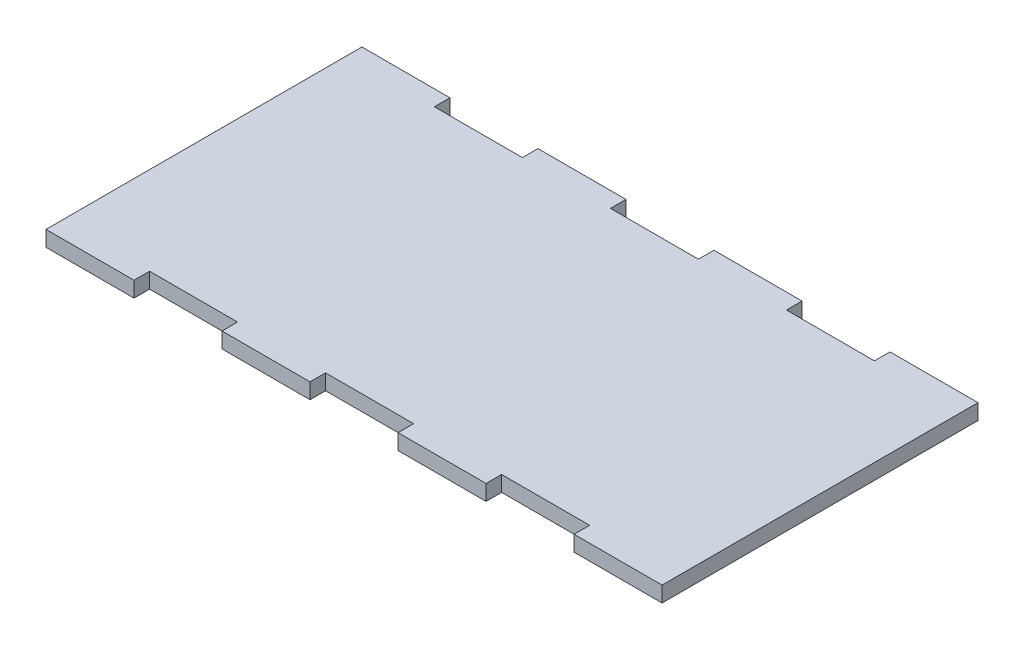
ISO-10303-21;
HEADER;
FILE_DESCRIPTION(('STEP AP214'),'2;1');
FILE_NAME('part.step','',(''),(''),'','','');
FILE_SCHEMA(('AUTOMOTIVE_DESIGN { 1 0 10303 214 1 1 1 1 }'));
ENDSEC;
DATA;
#1=APPLICATION_CONTEXT('core data for automotive mechanical design processes');
#2=APPLICATION_PROTOCOL_DEFINITION('international standard','automotive_design',2000,#1);
#3=PRODUCT_CONTEXT('',#1,'mechanical');
#4=PRODUCT('Part','Part','',(#3));
#5=PRODUCT_RELATED_PRODUCT_CATEGORY('part','',(#4));
#6=PRODUCT_DEFINITION_FORMATION('','',#4);
#7=PRODUCT_DEFINITION_CONTEXT('part definition',#1,'design');
#8=PRODUCT_DEFINITION('design','',#6,#7);
#9=PRODUCT_DEFINITION_SHAPE('','',#8);
#10=(LENGTH_UNIT() NAMED_UNIT(*) SI_UNIT(.MILLI.,.METRE.));
#11=(NAMED_UNIT(*) PLANE_ANGLE_UNIT() SI_UNIT($,.RADIAN.));
#12=(NAMED_UNIT(*) SI_UNIT($,.STERADIAN.) SOLID_ANGLE_UNIT());
#13=UNCERTAINTY_MEASURE_WITH_UNIT(LENGTH_MEASURE(1.E-05),#10,'distance_accuracy_value','');
#14=(GEOMETRIC_REPRESENTATION_CONTEXT(3) GLOBAL_UNCERTAINTY_ASSIGNED_CONTEXT((#13)) GLOBAL_UNIT_ASSIGNED_CONTEXT((#10,
#11,#12)) REPRESENTATION_CONTEXT('',''));
#15=CARTESIAN_POINT('',(0.,0.,0.));
#16=DIRECTION('',(0.,0.,1.));
#17=DIRECTION('',(1.,0.,0.));
#18=AXIS2_PLACEMENT_3D('',#15,#16,#17);
#19=CARTESIAN_POINT('',(49.53,2.5,25.4));
#20=DIRECTION('',(0.,0.,-1.));
#21=DIRECTION('',(-1.,0.,0.));
#22=AXIS2_PLACEMENT_3D('',#19,#20,#21);
#23=PLANE('',#22);
#24=DIRECTION('',(1.,0.,0.));
#25=VECTOR('',#24,1.);
#26=CARTESIAN_POINT('',(49.53,0.,25.4));
#27=LINE('',#26,#25);
#28=CARTESIAN_POINT('',(-49.53,0.,25.4));
#29=VERTEX_POINT('',#28);
#30=CARTESIAN_POINT('',(-35.3785714285714,0.,25.4));
#31=VERTEX_POINT('',#30);
#32=EDGE_CURVE('E285',#29,#31,#27,.T.);
#33=ORIENTED_EDGE('',*,*,#32,.T.);
#34=DIRECTION('',(0.,1.,0.));
#35=VECTOR('',#34,1.);
#36=CARTESIAN_POINT('',(-35.3785714285714,-0.0400000000000001,25.4));
#37=LINE('',#36,#35);
#38=CARTESIAN_POINT('',(-35.3785714285714,2.5,25.4));
#39=VERTEX_POINT('',#38);
#40=EDGE_CURVE('E413',#31,#39,#37,.T.);
#41=ORIENTED_EDGE('',*,*,#40,.T.);
#42=DIRECTION('',(1.,0.,0.));
#43=VECTOR('',#42,1.);
#44=CARTESIAN_POINT('',(49.53,2.5,25.4));
#45=LINE('',#44,#43);
#46=CARTESIAN_POINT('',(-49.53,2.5,25.4));
#47=VERTEX_POINT('',#46);
#48=EDGE_CURVE('E262',#47,#39,#45,.T.);
#49=ORIENTED_EDGE('',*,*,#48,.F.);
#50=DIRECTION('',(0.,-1.,0.));
#51=VECTOR('',#50,1.);
#52=CARTESIAN_POINT('',(-49.53,2.5,25.4));
#53=LINE('',#52,#51);
#54=EDGE_CURVE('E310',#47,#29,#53,.T.);
#55=ORIENTED_EDGE('',*,*,#54,.T.);
#56=EDGE_LOOP('',(#33,#41,#49,#55));
#57=FACE_BOUND('',#56,.T.);
#58=ADVANCED_FACE('F38',(#57),#23,.F.);
#59=CARTESIAN_POINT('',(-21.2271428571429,2.5,25.4));
#60=VERTEX_POINT('',#59);
#61=CARTESIAN_POINT('',(-7.07571428571428,2.5,25.4));
#62=VERTEX_POINT('',#61);
#63=EDGE_CURVE('E256',#60,#62,#45,.T.);
#64=ORIENTED_EDGE('',*,*,#63,.F.);
#65=DIRECTION('',(0.,1.,0.));
#66=VECTOR('',#65,1.);
#67=CARTESIAN_POINT('',(-21.2271428571429,-0.0400000000000001,25.4));
#68=LINE('',#67,#66);
#69=CARTESIAN_POINT('',(-21.2271428571429,0.,25.4));
#70=VERTEX_POINT('',#69);
#71=EDGE_CURVE('E479',#70,#60,#68,.T.);
#72=ORIENTED_EDGE('',*,*,#71,.F.);
#73=CARTESIAN_POINT('',(-7.07571428571428,0.,25.4));
#74=VERTEX_POINT('',#73);
#75=EDGE_CURVE('E290',#70,#74,#27,.T.);
#76=ORIENTED_EDGE('',*,*,#75,.T.);
#77=DIRECTION('',(0.,1.,0.));
#78=VECTOR('',#77,1.);
#79=CARTESIAN_POINT('',(-7.07571428571428,-0.0400000000000001,25.4));
#80=LINE('',#79,#78);
#81=EDGE_CURVE('E493',#74,#62,#80,.T.);
#82=ORIENTED_EDGE('',*,*,#81,.T.);
#83=EDGE_LOOP('',(#64,#72,#76,#82));
#84=FACE_BOUND('',#83,.T.);
#85=ADVANCED_FACE('F601',(#84),#23,.F.);
#86=CARTESIAN_POINT('',(7.07571428571428,2.5,25.4));
#87=VERTEX_POINT('',#86);
#88=CARTESIAN_POINT('',(21.2271428571429,2.5,25.4));
#89=VERTEX_POINT('',#88);
#90=EDGE_CURVE('E242',#87,#89,#45,.T.);
#91=ORIENTED_EDGE('',*,*,#90,.F.);
#92=DIRECTION('',(0.,1.,0.));
#93=VECTOR('',#92,1.);
#94=CARTESIAN_POINT('',(7.07571428571428,-0.0400000000000001,25.4));
#95=LINE('',#94,#93);
#96=CARTESIAN_POINT('',(7.07571428571428,0.,25.4));
#97=VERTEX_POINT('',#96);
#98=EDGE_CURVE('E499',#97,#87,#95,.T.);
#99=ORIENTED_EDGE('',*,*,#98,.F.);
#100=CARTESIAN_POINT('',(21.2271428571429,0.,25.4));
#101=VERTEX_POINT('',#100);
#102=EDGE_CURVE('E244',#97,#101,#27,.T.);
#103=ORIENTED_EDGE('',*,*,#102,.T.);
#104=DIRECTION('',(0.,1.,0.));
#105=VECTOR('',#104,1.);
#106=CARTESIAN_POINT('',(21.2271428571429,-0.0400000000000001,25.4));
#107=LINE('',#106,#105);
#108=EDGE_CURVE('E226',#101,#89,#107,.T.);
#109=ORIENTED_EDGE('',*,*,#108,.T.);
#110=EDGE_LOOP('',(#91,#99,#103,#109));
#111=FACE_BOUND('',#110,.T.);
#112=ADVANCED_FACE('F240',(#111),#23,.F.);
#113=CARTESIAN_POINT('',(49.53,2.5,-25.4));
#114=DIRECTION('',(0.,0.,1.));
#115=DIRECTION('',(1.,0.,0.));
#116=AXIS2_PLACEMENT_3D('',#113,#114,#115);
#117=PLANE('',#116);
#118=DIRECTION('',(-1.,0.,0.));
#119=VECTOR('',#118,1.);
#120=CARTESIAN_POINT('',(49.53,2.5,-25.4));
#121=LINE('',#120,#119);
#122=CARTESIAN_POINT('',(-7.07571428571428,2.5,-25.4));
#123=VERTEX_POINT('',#122);
#124=CARTESIAN_POINT('',(-21.2271428571429,2.5,-25.4));
#125=VERTEX_POINT('',#124);
#126=EDGE_CURVE('E421',#123,#125,#121,.T.);
#127=ORIENTED_EDGE('',*,*,#126,.F.);
#128=DIRECTION('',(0.,1.,0.));
#129=VECTOR('',#128,1.);
#130=CARTESIAN_POINT('',(-7.07571428571428,-0.0400000000000001,-25.4));
#131=LINE('',#130,#129);
#132=CARTESIAN_POINT('',(-7.07571428571428,0.,-25.4));
#133=VERTEX_POINT('',#132);
#134=EDGE_CURVE('E508',#133,#123,#131,.T.);
#135=ORIENTED_EDGE('',*,*,#134,.F.);
#136=DIRECTION('',(-1.,0.,0.));
#137=VECTOR('',#136,1.);
#138=CARTESIAN_POINT('',(49.53,0.,-25.4));
#139=LINE('',#138,#137);
#140=CARTESIAN_POINT('',(-21.2271428571429,0.,-25.4));
#141=VERTEX_POINT('',#140);
#142=EDGE_CURVE('E393',#133,#141,#139,.T.);
#143=ORIENTED_EDGE('',*,*,#142,.T.);
#144=DIRECTION('',(0.,1.,0.));
#145=VECTOR('',#144,1.);
#146=CARTESIAN_POINT('',(-21.2271428571429,-0.0400000000000001,-25.4));
#147=LINE('',#146,#145);
#148=EDGE_CURVE('E518',#141,#125,#147,.T.);
#149=ORIENTED_EDGE('',*,*,#148,.T.);
#150=EDGE_LOOP('',(#127,#135,#143,#149));
#151=FACE_BOUND('',#150,.T.);
#152=ADVANCED_FACE('F532',(#151),#117,.F.);
#153=CARTESIAN_POINT('',(21.2271428571429,0.,-25.4));
#154=VERTEX_POINT('',#153);
#155=CARTESIAN_POINT('',(7.07571428571428,0.,-25.4));
#156=VERTEX_POINT('',#155);
#157=EDGE_CURVE('E298',#154,#156,#139,.T.);
#158=ORIENTED_EDGE('',*,*,#157,.T.);
#159=DIRECTION('',(0.,1.,0.));
#160=VECTOR('',#159,1.);
#161=CARTESIAN_POINT('',(7.07571428571428,-0.0400000000000001,-25.4));
#162=LINE('',#161,#160);
#163=CARTESIAN_POINT('',(7.07571428571428,2.5,-25.4));
#164=VERTEX_POINT('',#163);
#165=EDGE_CURVE('E389',#156,#164,#162,.T.);
#166=ORIENTED_EDGE('',*,*,#165,.T.);
#167=CARTESIAN_POINT('',(21.2271428571429,2.5,-25.4));
#168=VERTEX_POINT('',#167);
#169=EDGE_CURVE('E278',#168,#164,#121,.T.);
#170=ORIENTED_EDGE('',*,*,#169,.F.);
#171=DIRECTION('',(0.,1.,0.));
#172=VECTOR('',#171,1.);
#173=CARTESIAN_POINT('',(21.2271428571429,-0.0400000000000001,-25.4));
#174=LINE('',#173,#172);
#175=EDGE_CURVE('E391',#154,#168,#174,.T.);
#176=ORIENTED_EDGE('',*,*,#175,.F.);
#177=EDGE_LOOP('',(#158,#166,#170,#176));
#178=FACE_BOUND('',#177,.T.);
#179=ADVANCED_FACE('F387',(#178),#117,.F.);
#180=CARTESIAN_POINT('',(-35.3785714285714,2.5,-25.4));
#181=VERTEX_POINT('',#180);
#182=CARTESIAN_POINT('',(-49.53,2.5,-25.4));
#183=VERTEX_POINT('',#182);
#184=EDGE_CURVE('E272',#181,#183,#121,.T.);
#185=ORIENTED_EDGE('',*,*,#184,.F.);
#186=DIRECTION('',(0.,1.,0.));
#187=VECTOR('',#186,1.);
#188=CARTESIAN_POINT('',(-35.3785714285714,-0.0400000000000001,-25.4));
#189=LINE('',#188,#187);
#190=CARTESIAN_POINT('',(-35.3785714285714,0.,-25.4));
#191=VERTEX_POINT('',#190);
#192=EDGE_CURVE('E284',#191,#181,#189,.T.);
#193=ORIENTED_EDGE('',*,*,#192,.F.);
#194=CARTESIAN_POINT('',(-49.53,0.,-25.4));
#195=VERTEX_POINT('',#194);
#196=EDGE_CURVE('E293',#191,#195,#139,.T.);
#197=ORIENTED_EDGE('',*,*,#196,.T.);
#198=DIRECTION('',(0.,-1.,0.));
#199=VECTOR('',#198,1.);
#200=CARTESIAN_POINT('',(-49.53,2.5,-25.4));
#201=LINE('',#200,#199);
#202=EDGE_CURVE('E277',#183,#195,#201,.T.);
#203=ORIENTED_EDGE('',*,*,#202,.F.);
#204=EDGE_LOOP('',(#185,#193,#197,#203));
#205=FACE_BOUND('',#204,.T.);
#206=ADVANCED_FACE('F405',(#205),#117,.F.);
#207=CARTESIAN_POINT('',(-49.53,2.5,25.4));
#208=DIRECTION('',(1.,0.,0.));
#209=DIRECTION('',(0.,0.,-1.));
#210=AXIS2_PLACEMENT_3D('',#207,#208,#209);
#211=PLANE('',#210);
#212=DIRECTION('',(0.,0.,1.));
#213=VECTOR('',#212,1.);
#214=CARTESIAN_POINT('',(-49.53,0.,25.4));
#215=LINE('',#214,#213);
#216=EDGE_CURVE('E279',#195,#29,#215,.T.);
#217=ORIENTED_EDGE('',*,*,#216,.T.);
#218=ORIENTED_EDGE('',*,*,#54,.F.);
#219=DIRECTION('',(0.,0.,1.));
#220=VECTOR('',#219,1.);
#221=CARTESIAN_POINT('',(-49.53,2.5,25.4));
#222=LINE('',#221,#220);
#223=EDGE_CURVE('E263',#183,#47,#222,.T.);
#224=ORIENTED_EDGE('',*,*,#223,.F.);
#225=ORIENTED_EDGE('',*,*,#202,.T.);
#226=EDGE_LOOP('',(#217,#218,#224,#225));
#227=FACE_BOUND('',#226,.T.);
#228=ADVANCED_FACE('F40',(#227),#211,.F.);
#229=CARTESIAN_POINT('',(35.3785714285714,2.5,25.4));
#230=VERTEX_POINT('',#229);
#231=CARTESIAN_POINT('',(49.53,2.5,25.4));
#232=VERTEX_POINT('',#231);
#233=EDGE_CURVE('E257',#230,#232,#45,.T.);
#234=ORIENTED_EDGE('',*,*,#233,.F.);
#235=DIRECTION('',(0.,1.,0.));
#236=VECTOR('',#235,1.);
#237=CARTESIAN_POINT('',(35.3785714285714,-0.0400000000000001,25.4));
#238=LINE('',#237,#236);
#239=CARTESIAN_POINT('',(35.3785714285714,0.,25.4));
#240=VERTEX_POINT('',#239);
#241=EDGE_CURVE('E246',#240,#230,#238,.T.);
#242=ORIENTED_EDGE('',*,*,#241,.F.);
#243=CARTESIAN_POINT('',(49.53,0.,25.4));
#244=VERTEX_POINT('',#243);
#245=EDGE_CURVE('E283',#240,#244,#27,.T.);
#246=ORIENTED_EDGE('',*,*,#245,.T.);
#247=DIRECTION('',(0.,-1.,0.));
#248=VECTOR('',#247,1.);
#249=CARTESIAN_POINT('',(49.53,2.5,25.4));
#250=LINE('',#249,#248);
#251=EDGE_CURVE('E306',#232,#244,#250,.T.);
#252=ORIENTED_EDGE('',*,*,#251,.F.);
#253=EDGE_LOOP('',(#234,#242,#246,#252));
#254=FACE_BOUND('',#253,.T.);
#255=ADVANCED_FACE('F573',(#254),#23,.F.);
#256=CARTESIAN_POINT('',(49.53,2.5,25.4));
#257=DIRECTION('',(-1.,0.,0.));
#258=DIRECTION('',(0.,0.,1.));
#259=AXIS2_PLACEMENT_3D('',#256,#257,#258);
#260=PLANE('',#259);
#261=DIRECTION('',(0.,0.,-1.));
#262=VECTOR('',#261,1.);
#263=CARTESIAN_POINT('',(49.53,0.,25.4));
#264=LINE('',#263,#262);
#265=CARTESIAN_POINT('',(49.53,0.,-25.4));
#266=VERTEX_POINT('',#265);
#267=EDGE_CURVE('E289',#244,#266,#264,.T.);
#268=ORIENTED_EDGE('',*,*,#267,.T.);
#269=DIRECTION('',(0.,-1.,0.));
#270=VECTOR('',#269,1.);
#271=CARTESIAN_POINT('',(49.53,2.5,-25.4));
#272=LINE('',#271,#270);
#273=CARTESIAN_POINT('',(49.53,2.5,-25.4));
#274=VERTEX_POINT('',#273);
#275=EDGE_CURVE('E302',#274,#266,#272,.T.);
#276=ORIENTED_EDGE('',*,*,#275,.F.);
#277=DIRECTION('',(0.,0.,-1.));
#278=VECTOR('',#277,1.);
#279=CARTESIAN_POINT('',(49.53,2.5,25.4));
#280=LINE('',#279,#278);
#281=EDGE_CURVE('E268',#232,#274,#280,.T.);
#282=ORIENTED_EDGE('',*,*,#281,.F.);
#283=ORIENTED_EDGE('',*,*,#251,.T.);
#284=EDGE_LOOP('',(#268,#276,#282,#283));
#285=FACE_BOUND('',#284,.T.);
#286=ADVANCED_FACE('F579',(#285),#260,.F.);
#287=CARTESIAN_POINT('',(35.3785714285714,0.,-25.4));
#288=VERTEX_POINT('',#287);
#289=EDGE_CURVE('E294',#266,#288,#139,.T.);
#290=ORIENTED_EDGE('',*,*,#289,.T.);
#291=DIRECTION('',(0.,1.,0.));
#292=VECTOR('',#291,1.);
#293=CARTESIAN_POINT('',(35.3785714285714,-0.0400000000000001,-25.4));
#294=LINE('',#293,#292);
#295=CARTESIAN_POINT('',(35.3785714285714,2.5,-25.4));
#296=VERTEX_POINT('',#295);
#297=EDGE_CURVE('E457',#288,#296,#294,.T.);
#298=ORIENTED_EDGE('',*,*,#297,.T.);
#299=EDGE_CURVE('E273',#274,#296,#121,.T.);
#300=ORIENTED_EDGE('',*,*,#299,.F.);
#301=ORIENTED_EDGE('',*,*,#275,.T.);
#302=EDGE_LOOP('',(#290,#298,#300,#301));
#303=FACE_BOUND('',#302,.T.);
#304=ADVANCED_FACE('F582',(#303),#117,.F.);
#305=CARTESIAN_POINT('',(0.,2.5,0.));
#306=DIRECTION('',(0.,1.,0.));
#307=DIRECTION('',(0.,0.,1.));
#308=AXIS2_PLACEMENT_3D('',#305,#306,#307);
#309=PLANE('',#308);
#310=DIRECTION('',(0.,0.,1.));
#311=VECTOR('',#310,1.);
#312=CARTESIAN_POINT('',(-7.07571428571428,2.5,-25.4));
#313=LINE('',#312,#311);
#314=CARTESIAN_POINT('',(-7.07571428571428,2.5,-22.9));
#315=VERTEX_POINT('',#314);
#316=EDGE_CURVE('E456',#123,#315,#313,.T.);
#317=ORIENTED_EDGE('',*,*,#316,.F.);
#318=ORIENTED_EDGE('',*,*,#126,.T.);
#319=DIRECTION('',(0.,0.,-1.));
#320=VECTOR('',#319,1.);
#321=CARTESIAN_POINT('',(-21.2271428571429,2.5,-25.4));
#322=LINE('',#321,#320);
#323=CARTESIAN_POINT('',(-21.2271428571429,2.5,-22.9));
#324=VERTEX_POINT('',#323);
#325=EDGE_CURVE('E512',#324,#125,#322,.T.);
#326=ORIENTED_EDGE('',*,*,#325,.F.);
#327=DIRECTION('',(1.,0.,0.));
#328=VECTOR('',#327,1.);
#329=CARTESIAN_POINT('',(-35.3785714285714,2.5,-22.9));
#330=LINE('',#329,#328);
#331=CARTESIAN_POINT('',(-35.3785714285714,2.5,-22.9));
#332=VERTEX_POINT('',#331);
#333=EDGE_CURVE('E507',#332,#324,#330,.T.);
#334=ORIENTED_EDGE('',*,*,#333,.F.);
#335=DIRECTION('',(0.,0.,1.));
#336=VECTOR('',#335,1.);
#337=CARTESIAN_POINT('',(-35.3785714285714,2.5,-25.4));
#338=LINE('',#337,#336);
#339=EDGE_CURVE('E419',#181,#332,#338,.T.);
#340=ORIENTED_EDGE('',*,*,#339,.F.);
#341=ORIENTED_EDGE('',*,*,#184,.T.);
#342=ORIENTED_EDGE('',*,*,#223,.T.);
#343=ORIENTED_EDGE('',*,*,#48,.T.);
#344=DIRECTION('',(0.,0.,1.));
#345=VECTOR('',#344,1.);
#346=CARTESIAN_POINT('',(-35.3785714285714,2.5,22.9));
#347=LINE('',#346,#345);
#348=CARTESIAN_POINT('',(-35.3785714285714,2.5,22.9));
#349=VERTEX_POINT('',#348);
#350=EDGE_CURVE('E465',#349,#39,#347,.T.);
#351=ORIENTED_EDGE('',*,*,#350,.F.);
#352=DIRECTION('',(-1.,0.,0.));
#353=VECTOR('',#352,1.);
#354=CARTESIAN_POINT('',(-35.3785714285714,2.5,22.9));
#355=LINE('',#354,#353);
#356=CARTESIAN_POINT('',(-21.2271428571429,2.5,22.9));
#357=VERTEX_POINT('',#356);
#358=EDGE_CURVE('E473',#357,#349,#355,.T.);
#359=ORIENTED_EDGE('',*,*,#358,.F.);
#360=DIRECTION('',(0.,0.,-1.));
#361=VECTOR('',#360,1.);
#362=CARTESIAN_POINT('',(-21.2271428571429,2.5,22.9));
#363=LINE('',#362,#361);
#364=EDGE_CURVE('E468',#60,#357,#363,.T.);
#365=ORIENTED_EDGE('',*,*,#364,.F.);
#366=ORIENTED_EDGE('',*,*,#63,.T.);
#367=DIRECTION('',(0.,0.,1.));
#368=VECTOR('',#367,1.);
#369=CARTESIAN_POINT('',(-7.07571428571428,2.5,22.9));
#370=LINE('',#369,#368);
#371=CARTESIAN_POINT('',(-7.07571428571428,2.5,22.9));
#372=VERTEX_POINT('',#371);
#373=EDGE_CURVE('E484',#372,#62,#370,.T.);
#374=ORIENTED_EDGE('',*,*,#373,.F.);
#375=DIRECTION('',(-1.,0.,0.));
#376=VECTOR('',#375,1.);
#377=CARTESIAN_POINT('',(-7.07571428571428,2.5,22.9));
#378=LINE('',#377,#376);
#379=CARTESIAN_POINT('',(7.07571428571428,2.5,22.9));
#380=VERTEX_POINT('',#379);
#381=EDGE_CURVE('E489',#380,#372,#378,.T.);
#382=ORIENTED_EDGE('',*,*,#381,.F.);
#383=DIRECTION('',(0.,0.,-1.));
#384=VECTOR('',#383,1.);
#385=CARTESIAN_POINT('',(7.07571428571428,2.5,22.9));
#386=LINE('',#385,#384);
#387=EDGE_CURVE('E254',#87,#380,#386,.T.);
#388=ORIENTED_EDGE('',*,*,#387,.F.);
#389=ORIENTED_EDGE('',*,*,#90,.T.);
#390=DIRECTION('',(0.,0.,1.));
#391=VECTOR('',#390,1.);
#392=CARTESIAN_POINT('',(21.2271428571429,2.5,22.9));
#393=LINE('',#392,#391);
#394=CARTESIAN_POINT('',(21.2271428571429,2.5,22.9));
#395=VERTEX_POINT('',#394);
#396=EDGE_CURVE('E223',#395,#89,#393,.T.);
#397=ORIENTED_EDGE('',*,*,#396,.F.);
#398=DIRECTION('',(-1.,0.,0.));
#399=VECTOR('',#398,1.);
#400=CARTESIAN_POINT('',(21.2271428571429,2.5,22.9));
#401=LINE('',#400,#399);
#402=CARTESIAN_POINT('',(35.3785714285714,2.5,22.9));
#403=VERTEX_POINT('',#402);
#404=EDGE_CURVE('E247',#403,#395,#401,.T.);
#405=ORIENTED_EDGE('',*,*,#404,.F.);
#406=DIRECTION('',(0.,0.,-1.));
#407=VECTOR('',#406,1.);
#408=CARTESIAN_POINT('',(35.3785714285714,2.5,22.9));
#409=LINE('',#408,#407);
#410=EDGE_CURVE('E235',#230,#403,#409,.T.);
#411=ORIENTED_EDGE('',*,*,#410,.F.);
#412=ORIENTED_EDGE('',*,*,#233,.T.);
#413=ORIENTED_EDGE('',*,*,#281,.T.);
#414=ORIENTED_EDGE('',*,*,#299,.T.);
#415=DIRECTION('',(0.,0.,-1.));
#416=VECTOR('',#415,1.);
#417=CARTESIAN_POINT('',(35.3785714285714,2.5,-25.4));
#418=LINE('',#417,#416);
#419=CARTESIAN_POINT('',(35.3785714285714,2.5,-22.9));
#420=VERTEX_POINT('',#419);
#421=EDGE_CURVE('E443',#420,#296,#418,.T.);
#422=ORIENTED_EDGE('',*,*,#421,.F.);
#423=DIRECTION('',(1.,0.,0.));
#424=VECTOR('',#423,1.);
#425=CARTESIAN_POINT('',(21.2271428571429,2.5,-22.9));
#426=LINE('',#425,#424);
#427=CARTESIAN_POINT('',(21.2271428571429,2.5,-22.9));
#428=VERTEX_POINT('',#427);
#429=EDGE_CURVE('E435',#428,#420,#426,.T.);
#430=ORIENTED_EDGE('',*,*,#429,.F.);
#431=DIRECTION('',(0.,0.,1.));
#432=VECTOR('',#431,1.);
#433=CARTESIAN_POINT('',(21.2271428571429,2.5,-25.4));
#434=LINE('',#433,#432);
#435=EDGE_CURVE('E433',#168,#428,#434,.T.);
#436=ORIENTED_EDGE('',*,*,#435,.F.);
#437=ORIENTED_EDGE('',*,*,#169,.T.);
#438=DIRECTION('',(0.,0.,-1.));
#439=VECTOR('',#438,1.);
#440=CARTESIAN_POINT('',(7.07571428571428,2.5,-25.4));
#441=LINE('',#440,#439);
#442=CARTESIAN_POINT('',(7.07571428571428,2.5,-22.9));
#443=VERTEX_POINT('',#442);
#444=EDGE_CURVE('E430',#443,#164,#441,.T.);
#445=ORIENTED_EDGE('',*,*,#444,.F.);
#446=DIRECTION('',(1.,0.,0.));
#447=VECTOR('',#446,1.);
#448=CARTESIAN_POINT('',(-7.07571428571428,2.5,-22.9));
#449=LINE('',#448,#447);
#450=EDGE_CURVE('E542',#315,#443,#449,.T.);
#451=ORIENTED_EDGE('',*,*,#450,.F.);
#452=EDGE_LOOP('',(#317,#318,#326,#334,#340,#341,#342,#343,#351,#359,#365,#366,#374,#382,#388,
#389,#397,#405,#411,#412,#413,#414,#422,#430,#436,#437,#445,#451));
#453=FACE_BOUND('',#452,.T.);
#454=ADVANCED_FACE('F251',(#453),#309,.T.);
#455=CARTESIAN_POINT('',(0.,0.,0.));
#456=DIRECTION('',(0.,1.,0.));
#457=DIRECTION('',(0.,0.,1.));
#458=AXIS2_PLACEMENT_3D('',#455,#456,#457);
#459=PLANE('',#458);
#460=ORIENTED_EDGE('',*,*,#142,.F.);
#461=DIRECTION('',(0.,0.,1.));
#462=VECTOR('',#461,1.);
#463=CARTESIAN_POINT('',(-7.07571428571428,0.,0.));
#464=LINE('',#463,#462);
#465=CARTESIAN_POINT('',(-7.07571428571428,0.,-22.9));
#466=VERTEX_POINT('',#465);
#467=EDGE_CURVE('E11',#133,#466,#464,.T.);
#468=ORIENTED_EDGE('',*,*,#467,.T.);
#469=DIRECTION('',(1.,0.,0.));
#470=VECTOR('',#469,1.);
#471=CARTESIAN_POINT('',(0.,0.,-22.9));
#472=LINE('',#471,#470);
#473=CARTESIAN_POINT('',(7.07571428571428,0.,-22.9));
#474=VERTEX_POINT('',#473);
#475=EDGE_CURVE('E373',#466,#474,#472,.T.);
#476=ORIENTED_EDGE('',*,*,#475,.T.);
#477=DIRECTION('',(0.,0.,-1.));
#478=VECTOR('',#477,1.);
#479=CARTESIAN_POINT('',(7.07571428571428,0.,0.));
#480=LINE('',#479,#478);
#481=EDGE_CURVE('E47',#474,#156,#480,.T.);
#482=ORIENTED_EDGE('',*,*,#481,.T.);
#483=ORIENTED_EDGE('',*,*,#157,.F.);
#484=DIRECTION('',(0.,0.,1.));
#485=VECTOR('',#484,1.);
#486=CARTESIAN_POINT('',(21.2271428571429,0.,0.));
#487=LINE('',#486,#485);
#488=CARTESIAN_POINT('',(21.2271428571429,0.,-22.9));
#489=VERTEX_POINT('',#488);
#490=EDGE_CURVE('E369',#154,#489,#487,.T.);
#491=ORIENTED_EDGE('',*,*,#490,.T.);
#492=DIRECTION('',(1.,0.,0.));
#493=VECTOR('',#492,1.);
#494=CARTESIAN_POINT('',(0.,0.,-22.9));
#495=LINE('',#494,#493);
#496=CARTESIAN_POINT('',(35.3785714285714,0.,-22.9));
#497=VERTEX_POINT('',#496);
#498=EDGE_CURVE('E361',#489,#497,#495,.T.);
#499=ORIENTED_EDGE('',*,*,#498,.T.);
#500=DIRECTION('',(0.,0.,-1.));
#501=VECTOR('',#500,1.);
#502=CARTESIAN_POINT('',(35.3785714285714,0.,0.));
#503=LINE('',#502,#501);
#504=EDGE_CURVE('E365',#497,#288,#503,.T.);
#505=ORIENTED_EDGE('',*,*,#504,.T.);
#506=ORIENTED_EDGE('',*,*,#289,.F.);
#507=ORIENTED_EDGE('',*,*,#267,.F.);
#508=ORIENTED_EDGE('',*,*,#245,.F.);
#509=DIRECTION('',(0.,0.,-1.));
#510=VECTOR('',#509,1.);
#511=CARTESIAN_POINT('',(35.3785714285714,0.,0.));
#512=LINE('',#511,#510);
#513=CARTESIAN_POINT('',(35.3785714285714,0.,22.9));
#514=VERTEX_POINT('',#513);
#515=EDGE_CURVE('E326',#240,#514,#512,.T.);
#516=ORIENTED_EDGE('',*,*,#515,.T.);
#517=DIRECTION('',(-1.,0.,0.));
#518=VECTOR('',#517,1.);
#519=CARTESIAN_POINT('',(0.,0.,22.9));
#520=LINE('',#519,#518);
#521=CARTESIAN_POINT('',(21.2271428571429,0.,22.9));
#522=VERTEX_POINT('',#521);
#523=EDGE_CURVE('E330',#514,#522,#520,.T.);
#524=ORIENTED_EDGE('',*,*,#523,.T.);
#525=DIRECTION('',(0.,0.,1.));
#526=VECTOR('',#525,1.);
#527=CARTESIAN_POINT('',(21.2271428571429,0.,0.));
#528=LINE('',#527,#526);
#529=EDGE_CURVE('E334',#522,#101,#528,.T.);
#530=ORIENTED_EDGE('',*,*,#529,.T.);
#531=ORIENTED_EDGE('',*,*,#102,.F.);
#532=DIRECTION('',(0.,0.,-1.));
#533=VECTOR('',#532,1.);
#534=CARTESIAN_POINT('',(7.07571428571428,0.,0.));
#535=LINE('',#534,#533);
#536=CARTESIAN_POINT('',(7.07571428571428,0.,22.9));
#537=VERTEX_POINT('',#536);
#538=EDGE_CURVE('E337',#97,#537,#535,.T.);
#539=ORIENTED_EDGE('',*,*,#538,.T.);
#540=DIRECTION('',(-1.,0.,0.));
#541=VECTOR('',#540,1.);
#542=CARTESIAN_POINT('',(0.,0.,22.9));
#543=LINE('',#542,#541);
#544=CARTESIAN_POINT('',(-7.07571428571428,0.,22.9));
#545=VERTEX_POINT('',#544);
#546=EDGE_CURVE('E341',#537,#545,#543,.T.);
#547=ORIENTED_EDGE('',*,*,#546,.T.);
#548=DIRECTION('',(0.,0.,1.));
#549=VECTOR('',#548,1.);
#550=CARTESIAN_POINT('',(-7.07571428571428,0.,0.));
#551=LINE('',#550,#549);
#552=EDGE_CURVE('E345',#545,#74,#551,.T.);
#553=ORIENTED_EDGE('',*,*,#552,.T.);
#554=ORIENTED_EDGE('',*,*,#75,.F.);
#555=DIRECTION('',(0.,0.,-1.));
#556=VECTOR('',#555,1.);
#557=CARTESIAN_POINT('',(-21.2271428571429,0.,0.));
#558=LINE('',#557,#556);
#559=CARTESIAN_POINT('',(-21.2271428571429,0.,22.9));
#560=VERTEX_POINT('',#559);
#561=EDGE_CURVE('E349',#70,#560,#558,.T.);
#562=ORIENTED_EDGE('',*,*,#561,.T.);
#563=DIRECTION('',(-1.,0.,0.));
#564=VECTOR('',#563,1.);
#565=CARTESIAN_POINT('',(0.,0.,22.9));
#566=LINE('',#565,#564);
#567=CARTESIAN_POINT('',(-35.3785714285714,0.,22.9));
#568=VERTEX_POINT('',#567);
#569=EDGE_CURVE('E353',#560,#568,#566,.T.);
#570=ORIENTED_EDGE('',*,*,#569,.T.);
#571=DIRECTION('',(0.,0.,1.));
#572=VECTOR('',#571,1.);
#573=CARTESIAN_POINT('',(-35.3785714285714,0.,0.));
#574=LINE('',#573,#572);
#575=EDGE_CURVE('E357',#568,#31,#574,.T.);
#576=ORIENTED_EDGE('',*,*,#575,.T.);
#577=ORIENTED_EDGE('',*,*,#32,.F.);
#578=ORIENTED_EDGE('',*,*,#216,.F.);
#579=ORIENTED_EDGE('',*,*,#196,.F.);
#580=DIRECTION('',(0.,0.,1.));
#581=VECTOR('',#580,1.);
#582=CARTESIAN_POINT('',(-35.3785714285714,0.,0.));
#583=LINE('',#582,#581);
#584=CARTESIAN_POINT('',(-35.3785714285714,0.,-22.9));
#585=VERTEX_POINT('',#584);
#586=EDGE_CURVE('E322',#191,#585,#583,.T.);
#587=ORIENTED_EDGE('',*,*,#586,.T.);
#588=DIRECTION('',(1.,0.,0.));
#589=VECTOR('',#588,1.);
#590=CARTESIAN_POINT('',(0.,0.,-22.9));
#591=LINE('',#590,#589);
#592=CARTESIAN_POINT('',(-21.2271428571429,0.,-22.9));
#593=VERTEX_POINT('',#592);
#594=EDGE_CURVE('E314',#585,#593,#591,.T.);
#595=ORIENTED_EDGE('',*,*,#594,.T.);
#596=DIRECTION('',(0.,0.,-1.));
#597=VECTOR('',#596,1.);
#598=CARTESIAN_POINT('',(-21.2271428571429,0.,0.));
#599=LINE('',#598,#597);
#600=EDGE_CURVE('E318',#593,#141,#599,.T.);
#601=ORIENTED_EDGE('',*,*,#600,.T.);
#602=EDGE_LOOP('',(#460,#468,#476,#482,#483,#491,#499,#505,#506,#507,#508,#516,#524,#530,#531,
#539,#547,#553,#554,#562,#570,#576,#577,#578,#579,#587,#595,#601));
#603=FACE_BOUND('',#602,.T.);
#604=ADVANCED_FACE('F382',(#603),#459,.F.);
#605=CARTESIAN_POINT('',(-35.3785714285714,-0.0400000000000001,-25.4));
#606=DIRECTION('',(-1.,0.,0.));
#607=DIRECTION('',(0.,0.,1.));
#608=AXIS2_PLACEMENT_3D('',#605,#606,#607);
#609=PLANE('',#608);
#610=ORIENTED_EDGE('',*,*,#192,.T.);
#611=ORIENTED_EDGE('',*,*,#339,.T.);
#612=DIRECTION('',(0.,1.,0.));
#613=VECTOR('',#612,1.);
#614=CARTESIAN_POINT('',(-35.3785714285714,-0.0400000000000001,-22.9));
#615=LINE('',#614,#613);
#616=EDGE_CURVE('E515',#585,#332,#615,.T.);
#617=ORIENTED_EDGE('',*,*,#616,.F.);
#618=ORIENTED_EDGE('',*,*,#586,.F.);
#619=EDGE_LOOP('',(#610,#611,#617,#618));
#620=FACE_BOUND('',#619,.T.);
#621=ADVANCED_FACE('F528',(#620),#609,.F.);
#622=CARTESIAN_POINT('',(-21.2271428571429,-0.0400000000000001,-25.4));
#623=DIRECTION('',(1.,0.,0.));
#624=DIRECTION('',(0.,0.,-1.));
#625=AXIS2_PLACEMENT_3D('',#622,#623,#624);
#626=PLANE('',#625);
#627=DIRECTION('',(0.,1.,0.));
#628=VECTOR('',#627,1.);
#629=CARTESIAN_POINT('',(-21.2271428571429,-0.0400000000000001,-22.9));
#630=LINE('',#629,#628);
#631=EDGE_CURVE('E521',#593,#324,#630,.T.);
#632=ORIENTED_EDGE('',*,*,#631,.T.);
#633=ORIENTED_EDGE('',*,*,#325,.T.);
#634=ORIENTED_EDGE('',*,*,#148,.F.);
#635=ORIENTED_EDGE('',*,*,#600,.F.);
#636=EDGE_LOOP('',(#632,#633,#634,#635));
#637=FACE_BOUND('',#636,.T.);
#638=ADVANCED_FACE('F530',(#637),#626,.F.);
#639=CARTESIAN_POINT('',(-35.3785714285714,-0.0400000000000001,-22.9));
#640=DIRECTION('',(0.,0.,1.));
#641=DIRECTION('',(1.,0.,0.));
#642=AXIS2_PLACEMENT_3D('',#639,#640,#641);
#643=PLANE('',#642);
#644=ORIENTED_EDGE('',*,*,#616,.T.);
#645=ORIENTED_EDGE('',*,*,#333,.T.);
#646=ORIENTED_EDGE('',*,*,#631,.F.);
#647=ORIENTED_EDGE('',*,*,#594,.F.);
#648=EDGE_LOOP('',(#644,#645,#646,#647));
#649=FACE_BOUND('',#648,.T.);
#650=ADVANCED_FACE('F526',(#649),#643,.F.);
#651=CARTESIAN_POINT('',(21.2271428571429,-0.0400000000000001,22.9));
#652=DIRECTION('',(-1.,0.,0.));
#653=DIRECTION('',(0.,0.,1.));
#654=AXIS2_PLACEMENT_3D('',#651,#652,#653);
#655=PLANE('',#654);
#656=DIRECTION('',(0.,1.,0.));
#657=VECTOR('',#656,1.);
#658=CARTESIAN_POINT('',(21.2271428571429,-0.0400000000000001,22.9));
#659=LINE('',#658,#657);
#660=EDGE_CURVE('E229',#522,#395,#659,.T.);
#661=ORIENTED_EDGE('',*,*,#660,.T.);
#662=ORIENTED_EDGE('',*,*,#396,.T.);
#663=ORIENTED_EDGE('',*,*,#108,.F.);
#664=ORIENTED_EDGE('',*,*,#529,.F.);
#665=EDGE_LOOP('',(#661,#662,#663,#664));
#666=FACE_BOUND('',#665,.T.);
#667=ADVANCED_FACE('F225',(#666),#655,.F.);
#668=CARTESIAN_POINT('',(21.2271428571429,-0.0400000000000001,22.9));
#669=DIRECTION('',(0.,0.,-1.));
#670=DIRECTION('',(-1.,0.,0.));
#671=AXIS2_PLACEMENT_3D('',#668,#669,#670);
#672=PLANE('',#671);
#673=DIRECTION('',(0.,1.,0.));
#674=VECTOR('',#673,1.);
#675=CARTESIAN_POINT('',(35.3785714285714,-0.0400000000000001,22.9));
#676=LINE('',#675,#674);
#677=EDGE_CURVE('E553',#514,#403,#676,.T.);
#678=ORIENTED_EDGE('',*,*,#677,.T.);
#679=ORIENTED_EDGE('',*,*,#404,.T.);
#680=ORIENTED_EDGE('',*,*,#660,.F.);
#681=ORIENTED_EDGE('',*,*,#523,.F.);
#682=EDGE_LOOP('',(#678,#679,#680,#681));
#683=FACE_BOUND('',#682,.T.);
#684=ADVANCED_FACE('F569',(#683),#672,.F.);
#685=CARTESIAN_POINT('',(35.3785714285714,-0.0400000000000001,22.9));
#686=DIRECTION('',(1.,0.,0.));
#687=DIRECTION('',(0.,0.,-1.));
#688=AXIS2_PLACEMENT_3D('',#685,#686,#687);
#689=PLANE('',#688);
#690=ORIENTED_EDGE('',*,*,#241,.T.);
#691=ORIENTED_EDGE('',*,*,#410,.T.);
#692=ORIENTED_EDGE('',*,*,#677,.F.);
#693=ORIENTED_EDGE('',*,*,#515,.F.);
#694=EDGE_LOOP('',(#690,#691,#692,#693));
#695=FACE_BOUND('',#694,.T.);
#696=ADVANCED_FACE('F564',(#695),#689,.F.);
#697=CARTESIAN_POINT('',(-7.07571428571428,-0.0400000000000001,22.9));
#698=DIRECTION('',(-1.,0.,0.));
#699=DIRECTION('',(0.,0.,1.));
#700=AXIS2_PLACEMENT_3D('',#697,#698,#699);
#701=PLANE('',#700);
#702=DIRECTION('',(0.,1.,0.));
#703=VECTOR('',#702,1.);
#704=CARTESIAN_POINT('',(-7.07571428571428,-0.0400000000000001,22.9));
#705=LINE('',#704,#703);
#706=EDGE_CURVE('E469',#545,#372,#705,.T.);
#707=ORIENTED_EDGE('',*,*,#706,.T.);
#708=ORIENTED_EDGE('',*,*,#373,.T.);
#709=ORIENTED_EDGE('',*,*,#81,.F.);
#710=ORIENTED_EDGE('',*,*,#552,.F.);
#711=EDGE_LOOP('',(#707,#708,#709,#710));
#712=FACE_BOUND('',#711,.T.);
#713=ADVANCED_FACE('F699',(#712),#701,.F.);
#714=CARTESIAN_POINT('',(-7.07571428571428,-0.0400000000000001,22.9));
#715=DIRECTION('',(0.,0.,-1.));
#716=DIRECTION('',(-1.,0.,0.));
#717=AXIS2_PLACEMENT_3D('',#714,#715,#716);
#718=PLANE('',#717);
#719=DIRECTION('',(0.,1.,0.));
#720=VECTOR('',#719,1.);
#721=CARTESIAN_POINT('',(7.07571428571428,-0.0400000000000001,22.9));
#722=LINE('',#721,#720);
#723=EDGE_CURVE('E496',#537,#380,#722,.T.);
#724=ORIENTED_EDGE('',*,*,#723,.T.);
#725=ORIENTED_EDGE('',*,*,#381,.T.);
#726=ORIENTED_EDGE('',*,*,#706,.F.);
#727=ORIENTED_EDGE('',*,*,#546,.F.);
#728=EDGE_LOOP('',(#724,#725,#726,#727));
#729=FACE_BOUND('',#728,.T.);
#730=ADVANCED_FACE('F707',(#729),#718,.F.);
#731=CARTESIAN_POINT('',(7.07571428571428,-0.0400000000000001,22.9));
#732=DIRECTION('',(1.,0.,0.));
#733=DIRECTION('',(0.,0.,-1.));
#734=AXIS2_PLACEMENT_3D('',#731,#732,#733);
#735=PLANE('',#734);
#736=ORIENTED_EDGE('',*,*,#98,.T.);
#737=ORIENTED_EDGE('',*,*,#387,.T.);
#738=ORIENTED_EDGE('',*,*,#723,.F.);
#739=ORIENTED_EDGE('',*,*,#538,.F.);
#740=EDGE_LOOP('',(#736,#737,#738,#739));
#741=FACE_BOUND('',#740,.T.);
#742=ADVANCED_FACE('F716',(#741),#735,.F.);
#743=CARTESIAN_POINT('',(-35.3785714285714,-0.0400000000000001,22.9));
#744=DIRECTION('',(-1.,0.,0.));
#745=DIRECTION('',(0.,0.,1.));
#746=AXIS2_PLACEMENT_3D('',#743,#744,#745);
#747=PLANE('',#746);
#748=DIRECTION('',(0.,1.,0.));
#749=VECTOR('',#748,1.);
#750=CARTESIAN_POINT('',(-35.3785714285714,-0.0400000000000001,22.9));
#751=LINE('',#750,#749);
#752=EDGE_CURVE('E439',#568,#349,#751,.T.);
#753=ORIENTED_EDGE('',*,*,#752,.T.);
#754=ORIENTED_EDGE('',*,*,#350,.T.);
#755=ORIENTED_EDGE('',*,*,#40,.F.);
#756=ORIENTED_EDGE('',*,*,#575,.F.);
#757=EDGE_LOOP('',(#753,#754,#755,#756));
#758=FACE_BOUND('',#757,.T.);
#759=ADVANCED_FACE('F725',(#758),#747,.F.);
#760=CARTESIAN_POINT('',(-35.3785714285714,-0.0400000000000001,22.9));
#761=DIRECTION('',(0.,0.,-1.));
#762=DIRECTION('',(-1.,0.,0.));
#763=AXIS2_PLACEMENT_3D('',#760,#761,#762);
#764=PLANE('',#763);
#765=DIRECTION('',(0.,1.,0.));
#766=VECTOR('',#765,1.);
#767=CARTESIAN_POINT('',(-21.2271428571429,-0.0400000000000001,22.9));
#768=LINE('',#767,#766);
#769=EDGE_CURVE('E445',#560,#357,#768,.T.);
#770=ORIENTED_EDGE('',*,*,#769,.T.);
#771=ORIENTED_EDGE('',*,*,#358,.T.);
#772=ORIENTED_EDGE('',*,*,#752,.F.);
#773=ORIENTED_EDGE('',*,*,#569,.F.);
#774=EDGE_LOOP('',(#770,#771,#772,#773));
#775=FACE_BOUND('',#774,.T.);
#776=ADVANCED_FACE('F595',(#775),#764,.F.);
#777=CARTESIAN_POINT('',(-21.2271428571429,-0.0400000000000001,22.9));
#778=DIRECTION('',(1.,0.,0.));
#779=DIRECTION('',(0.,0.,-1.));
#780=AXIS2_PLACEMENT_3D('',#777,#778,#779);
#781=PLANE('',#780);
#782=ORIENTED_EDGE('',*,*,#71,.T.);
#783=ORIENTED_EDGE('',*,*,#364,.T.);
#784=ORIENTED_EDGE('',*,*,#769,.F.);
#785=ORIENTED_EDGE('',*,*,#561,.F.);
#786=EDGE_LOOP('',(#782,#783,#784,#785));
#787=FACE_BOUND('',#786,.T.);
#788=ADVANCED_FACE('F588',(#787),#781,.F.);
#789=CARTESIAN_POINT('',(21.2271428571429,-0.0400000000000001,-25.4));
#790=DIRECTION('',(-1.,0.,0.));
#791=DIRECTION('',(0.,0.,1.));
#792=AXIS2_PLACEMENT_3D('',#789,#790,#791);
#793=PLANE('',#792);
#794=ORIENTED_EDGE('',*,*,#175,.T.);
#795=ORIENTED_EDGE('',*,*,#435,.T.);
#796=DIRECTION('',(0.,1.,0.));
#797=VECTOR('',#796,1.);
#798=CARTESIAN_POINT('',(21.2271428571429,-0.0400000000000001,-22.9));
#799=LINE('',#798,#797);
#800=EDGE_CURVE('E453',#489,#428,#799,.T.);
#801=ORIENTED_EDGE('',*,*,#800,.F.);
#802=ORIENTED_EDGE('',*,*,#490,.F.);
#803=EDGE_LOOP('',(#794,#795,#801,#802));
#804=FACE_BOUND('',#803,.T.);
#805=ADVANCED_FACE('F586',(#804),#793,.F.);
#806=CARTESIAN_POINT('',(35.3785714285714,-0.0400000000000001,-25.4));
#807=DIRECTION('',(1.,0.,0.));
#808=DIRECTION('',(0.,0.,-1.));
#809=AXIS2_PLACEMENT_3D('',#806,#807,#808);
#810=PLANE('',#809);
#811=DIRECTION('',(0.,1.,0.));
#812=VECTOR('',#811,1.);
#813=CARTESIAN_POINT('',(35.3785714285714,-0.0400000000000001,-22.9));
#814=LINE('',#813,#812);
#815=EDGE_CURVE('E62',#497,#420,#814,.T.);
#816=ORIENTED_EDGE('',*,*,#815,.T.);
#817=ORIENTED_EDGE('',*,*,#421,.T.);
#818=ORIENTED_EDGE('',*,*,#297,.F.);
#819=ORIENTED_EDGE('',*,*,#504,.F.);
#820=EDGE_LOOP('',(#816,#817,#818,#819));
#821=FACE_BOUND('',#820,.T.);
#822=ADVANCED_FACE('F584',(#821),#810,.F.);
#823=CARTESIAN_POINT('',(21.2271428571429,-0.0400000000000001,-22.9));
#824=DIRECTION('',(0.,0.,1.));
#825=DIRECTION('',(1.,0.,0.));
#826=AXIS2_PLACEMENT_3D('',#823,#824,#825);
#827=PLANE('',#826);
#828=ORIENTED_EDGE('',*,*,#800,.T.);
#829=ORIENTED_EDGE('',*,*,#429,.T.);
#830=ORIENTED_EDGE('',*,*,#815,.F.);
#831=ORIENTED_EDGE('',*,*,#498,.F.);
#832=EDGE_LOOP('',(#828,#829,#830,#831));
#833=FACE_BOUND('',#832,.T.);
#834=ADVANCED_FACE('F585',(#833),#827,.F.);
#835=CARTESIAN_POINT('',(-7.07571428571428,-0.0400000000000001,-25.4));
#836=DIRECTION('',(-1.,0.,0.));
#837=DIRECTION('',(0.,0.,1.));
#838=AXIS2_PLACEMENT_3D('',#835,#836,#837);
#839=PLANE('',#838);
#840=ORIENTED_EDGE('',*,*,#134,.T.);
#841=ORIENTED_EDGE('',*,*,#316,.T.);
#842=DIRECTION('',(0.,1.,0.));
#843=VECTOR('',#842,1.);
#844=CARTESIAN_POINT('',(-7.07571428571428,-0.0400000000000001,-22.9));
#845=LINE('',#844,#843);
#846=EDGE_CURVE('E448',#466,#315,#845,.T.);
#847=ORIENTED_EDGE('',*,*,#846,.F.);
#848=ORIENTED_EDGE('',*,*,#467,.F.);
#849=EDGE_LOOP('',(#840,#841,#847,#848));
#850=FACE_BOUND('',#849,.T.);
#851=ADVANCED_FACE('F538',(#850),#839,.F.);
#852=CARTESIAN_POINT('',(7.07571428571428,-0.0400000000000001,-25.4));
#853=DIRECTION('',(1.,0.,0.));
#854=DIRECTION('',(0.,0.,-1.));
#855=AXIS2_PLACEMENT_3D('',#852,#853,#854);
#856=PLANE('',#855);
#857=DIRECTION('',(0.,1.,0.));
#858=VECTOR('',#857,1.);
#859=CARTESIAN_POINT('',(7.07571428571428,-0.0400000000000001,-22.9));
#860=LINE('',#859,#858);
#861=EDGE_CURVE('E54',#474,#443,#860,.T.);
#862=ORIENTED_EDGE('',*,*,#861,.T.);
#863=ORIENTED_EDGE('',*,*,#444,.T.);
#864=ORIENTED_EDGE('',*,*,#165,.F.);
#865=ORIENTED_EDGE('',*,*,#481,.F.);
#866=EDGE_LOOP('',(#862,#863,#864,#865));
#867=FACE_BOUND('',#866,.T.);
#868=ADVANCED_FACE('F769',(#867),#856,.F.);
#869=CARTESIAN_POINT('',(-7.07571428571428,-0.0400000000000001,-22.9));
#870=DIRECTION('',(0.,0.,1.));
#871=DIRECTION('',(1.,0.,0.));
#872=AXIS2_PLACEMENT_3D('',#869,#870,#871);
#873=PLANE('',#872);
#874=ORIENTED_EDGE('',*,*,#846,.T.);
#875=ORIENTED_EDGE('',*,*,#450,.T.);
#876=ORIENTED_EDGE('',*,*,#861,.F.);
#877=ORIENTED_EDGE('',*,*,#475,.F.);
#878=EDGE_LOOP('',(#874,#875,#876,#877));
#879=FACE_BOUND('',#878,.T.);
#880=ADVANCED_FACE('F777',(#879),#873,.F.);
#881=CLOSED_SHELL('',(#58,#85,#112,#152,#179,#206,#228,#255,#286,#304,#454,#604,#621,#638,#650,
#667,#684,#696,#713,#730,#742,#759,#776,#788,#805,#822,#834,#851,#868,#880));
#882=MANIFOLD_SOLID_BREP('B2',#881);
#883=ADVANCED_BREP_SHAPE_REPRESENTATION('',(#18,#882),#14);
#884=SHAPE_DEFINITION_REPRESENTATION(#9,#883);
ENDSEC;
END-ISO-10303-21;
